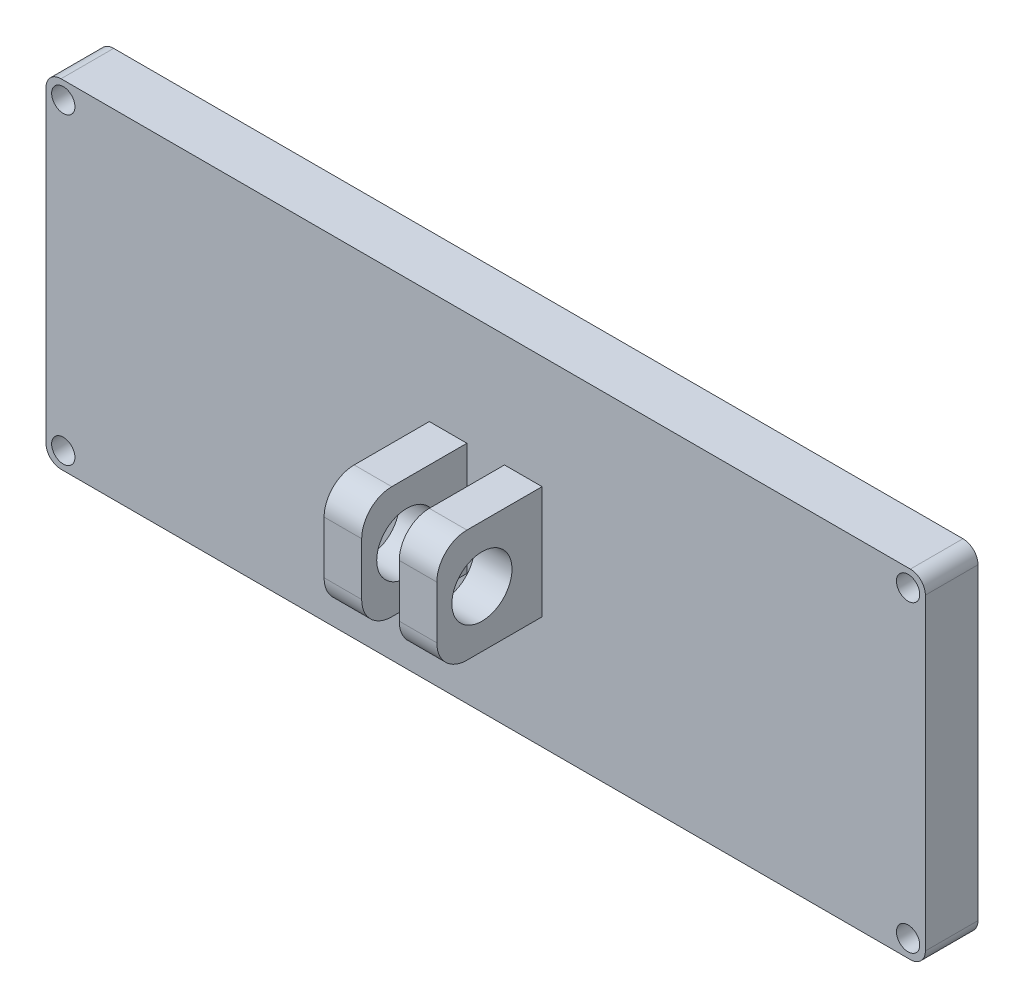
ISO-10303-21;
HEADER;
FILE_DESCRIPTION(('STEP AP214'),'2;1');
FILE_NAME('part.step','',(''),(''),'','','');
FILE_SCHEMA(('AUTOMOTIVE_DESIGN { 1 0 10303 214 1 1 1 1 }'));
ENDSEC;
DATA;
#1=APPLICATION_CONTEXT('core data for automotive mechanical design processes');
#2=APPLICATION_PROTOCOL_DEFINITION('international standard','automotive_design',2000,#1);
#3=PRODUCT_CONTEXT('',#1,'mechanical');
#4=PRODUCT('Part','Part','',(#3));
#5=PRODUCT_RELATED_PRODUCT_CATEGORY('part','',(#4));
#6=PRODUCT_DEFINITION_FORMATION('','',#4);
#7=PRODUCT_DEFINITION_CONTEXT('part definition',#1,'design');
#8=PRODUCT_DEFINITION('design','',#6,#7);
#9=PRODUCT_DEFINITION_SHAPE('','',#8);
#10=(LENGTH_UNIT() NAMED_UNIT(*) SI_UNIT(.MILLI.,.METRE.));
#11=(NAMED_UNIT(*) PLANE_ANGLE_UNIT() SI_UNIT($,.RADIAN.));
#12=(NAMED_UNIT(*) SI_UNIT($,.STERADIAN.) SOLID_ANGLE_UNIT());
#13=UNCERTAINTY_MEASURE_WITH_UNIT(LENGTH_MEASURE(1.E-05),#10,'distance_accuracy_value','');
#14=(GEOMETRIC_REPRESENTATION_CONTEXT(3) GLOBAL_UNCERTAINTY_ASSIGNED_CONTEXT((#13)) GLOBAL_UNIT_ASSIGNED_CONTEXT((#10,
#11,#12)) REPRESENTATION_CONTEXT('',''));
#15=CARTESIAN_POINT('',(0.,0.,0.));
#16=DIRECTION('',(0.,0.,1.));
#17=DIRECTION('',(1.,0.,0.));
#18=AXIS2_PLACEMENT_3D('',#15,#16,#17);
#19=CARTESIAN_POINT('',(54.25,-17.75,5.));
#20=DIRECTION('',(0.,-1.,0.));
#21=DIRECTION('',(0.,0.,-1.));
#22=AXIS2_PLACEMENT_3D('',#19,#20,#21);
#23=PLANE('',#22);
#24=DIRECTION('',(0.,0.,1.));
#25=VECTOR('',#24,1.);
#26=CARTESIAN_POINT('',(-34.25,-17.75,3.5));
#27=LINE('',#26,#25);
#28=CARTESIAN_POINT('',(-34.25,-17.75,3.5));
#29=VERTEX_POINT('',#28);
#30=CARTESIAN_POINT('',(-34.25,-17.75,5.));
#31=VERTEX_POINT('',#30);
#32=EDGE_CURVE('E257',#29,#31,#27,.T.);
#33=ORIENTED_EDGE('',*,*,#32,.T.);
#34=DIRECTION('',(-1.,0.,0.));
#35=VECTOR('',#34,1.);
#36=CARTESIAN_POINT('',(54.25,-17.75,5.));
#37=LINE('',#36,#35);
#38=CARTESIAN_POINT('',(34.25,-17.75,5.));
#39=VERTEX_POINT('',#38);
#40=EDGE_CURVE('E237',#39,#31,#37,.T.);
#41=ORIENTED_EDGE('',*,*,#40,.F.);
#42=DIRECTION('',(0.,0.,1.));
#43=VECTOR('',#42,1.);
#44=CARTESIAN_POINT('',(34.25,-17.75,3.5));
#45=LINE('',#44,#43);
#46=CARTESIAN_POINT('',(34.25,-17.75,3.5));
#47=VERTEX_POINT('',#46);
#48=EDGE_CURVE('E287',#47,#39,#45,.T.);
#49=ORIENTED_EDGE('',*,*,#48,.F.);
#50=DIRECTION('',(-1.,0.,0.));
#51=VECTOR('',#50,1.);
#52=CARTESIAN_POINT('',(54.25,-17.75,3.5));
#53=LINE('',#52,#51);
#54=CARTESIAN_POINT('',(54.25,-17.75,3.5));
#55=VERTEX_POINT('',#54);
#56=EDGE_CURVE('E268',#55,#47,#53,.T.);
#57=ORIENTED_EDGE('',*,*,#56,.F.);
#58=DIRECTION('',(0.,0.,-1.));
#59=VECTOR('',#58,1.);
#60=CARTESIAN_POINT('',(54.25,-17.75,5.));
#61=LINE('',#60,#59);
#62=CARTESIAN_POINT('',(54.25,-17.75,0.));
#63=VERTEX_POINT('',#62);
#64=EDGE_CURVE('E437',#55,#63,#61,.T.);
#65=ORIENTED_EDGE('',*,*,#64,.T.);
#66=DIRECTION('',(-1.,0.,0.));
#67=VECTOR('',#66,1.);
#68=CARTESIAN_POINT('',(54.25,-17.75,0.));
#69=LINE('',#68,#67);
#70=CARTESIAN_POINT('',(-54.25,-17.75,0.));
#71=VERTEX_POINT('',#70);
#72=EDGE_CURVE('E417',#63,#71,#69,.T.);
#73=ORIENTED_EDGE('',*,*,#72,.T.);
#74=DIRECTION('',(0.,0.,-1.));
#75=VECTOR('',#74,1.);
#76=CARTESIAN_POINT('',(-54.25,-17.75,5.));
#77=LINE('',#76,#75);
#78=CARTESIAN_POINT('',(-54.25,-17.75,3.5));
#79=VERTEX_POINT('',#78);
#80=EDGE_CURVE('E433',#79,#71,#77,.T.);
#81=ORIENTED_EDGE('',*,*,#80,.F.);
#82=DIRECTION('',(-1.,0.,0.));
#83=VECTOR('',#82,1.);
#84=CARTESIAN_POINT('',(-54.25,-17.75,3.5));
#85=LINE('',#84,#83);
#86=EDGE_CURVE('E55',#29,#79,#85,.T.);
#87=ORIENTED_EDGE('',*,*,#86,.F.);
#88=EDGE_LOOP('',(#33,#41,#49,#57,#65,#73,#81,#87));
#89=FACE_BOUND('',#88,.T.);
#90=ADVANCED_FACE('F39',(#89),#23,.F.);
#91=CARTESIAN_POINT('',(54.25,17.75,5.));
#92=DIRECTION('',(0.,1.,0.));
#93=DIRECTION('',(0.,0.,1.));
#94=AXIS2_PLACEMENT_3D('',#91,#92,#93);
#95=PLANE('',#94);
#96=DIRECTION('',(0.,0.,1.));
#97=VECTOR('',#96,1.);
#98=CARTESIAN_POINT('',(-34.25,17.75,3.5));
#99=LINE('',#98,#97);
#100=CARTESIAN_POINT('',(-34.25,17.75,3.5));
#101=VERTEX_POINT('',#100);
#102=CARTESIAN_POINT('',(-34.25,17.75,5.));
#103=VERTEX_POINT('',#102);
#104=EDGE_CURVE('E63',#101,#103,#99,.T.);
#105=ORIENTED_EDGE('',*,*,#104,.F.);
#106=DIRECTION('',(1.,0.,0.));
#107=VECTOR('',#106,1.);
#108=CARTESIAN_POINT('',(-54.25,17.75,3.5));
#109=LINE('',#108,#107);
#110=CARTESIAN_POINT('',(-54.25,17.75,3.5));
#111=VERTEX_POINT('',#110);
#112=EDGE_CURVE('E239',#111,#101,#109,.T.);
#113=ORIENTED_EDGE('',*,*,#112,.F.);
#114=DIRECTION('',(0.,0.,-1.));
#115=VECTOR('',#114,1.);
#116=CARTESIAN_POINT('',(-54.25,17.75,5.));
#117=LINE('',#116,#115);
#118=CARTESIAN_POINT('',(-54.25,17.75,0.));
#119=VERTEX_POINT('',#118);
#120=EDGE_CURVE('E227',#111,#119,#117,.T.);
#121=ORIENTED_EDGE('',*,*,#120,.T.);
#122=DIRECTION('',(1.,0.,0.));
#123=VECTOR('',#122,1.);
#124=CARTESIAN_POINT('',(54.25,17.75,0.));
#125=LINE('',#124,#123);
#126=CARTESIAN_POINT('',(54.25,17.75,0.));
#127=VERTEX_POINT('',#126);
#128=EDGE_CURVE('E423',#119,#127,#125,.T.);
#129=ORIENTED_EDGE('',*,*,#128,.T.);
#130=DIRECTION('',(0.,0.,-1.));
#131=VECTOR('',#130,1.);
#132=CARTESIAN_POINT('',(54.25,17.75,5.));
#133=LINE('',#132,#131);
#134=CARTESIAN_POINT('',(54.25,17.75,3.5));
#135=VERTEX_POINT('',#134);
#136=EDGE_CURVE('E236',#135,#127,#133,.T.);
#137=ORIENTED_EDGE('',*,*,#136,.F.);
#138=DIRECTION('',(1.,0.,0.));
#139=VECTOR('',#138,1.);
#140=CARTESIAN_POINT('',(54.25,17.75,3.5));
#141=LINE('',#140,#139);
#142=CARTESIAN_POINT('',(34.25,17.75,3.5));
#143=VERTEX_POINT('',#142);
#144=EDGE_CURVE('E276',#143,#135,#141,.T.);
#145=ORIENTED_EDGE('',*,*,#144,.F.);
#146=DIRECTION('',(0.,0.,1.));
#147=VECTOR('',#146,1.);
#148=CARTESIAN_POINT('',(34.25,17.75,3.5));
#149=LINE('',#148,#147);
#150=CARTESIAN_POINT('',(34.25,17.75,5.));
#151=VERTEX_POINT('',#150);
#152=EDGE_CURVE('E280',#143,#151,#149,.T.);
#153=ORIENTED_EDGE('',*,*,#152,.T.);
#154=DIRECTION('',(1.,0.,0.));
#155=VECTOR('',#154,1.);
#156=CARTESIAN_POINT('',(54.25,17.75,5.));
#157=LINE('',#156,#155);
#158=EDGE_CURVE('E414',#103,#151,#157,.T.);
#159=ORIENTED_EDGE('',*,*,#158,.F.);
#160=EDGE_LOOP('',(#105,#113,#121,#129,#137,#145,#153,#159));
#161=FACE_BOUND('',#160,.T.);
#162=ADVANCED_FACE('F240',(#161),#95,.F.);
#163=CARTESIAN_POINT('',(0.,0.,5.));
#164=DIRECTION('',(0.,0.,1.));
#165=DIRECTION('',(1.,0.,0.));
#166=AXIS2_PLACEMENT_3D('',#163,#164,#165);
#167=PLANE('',#166);
#168=DIRECTION('',(0.,-1.,0.));
#169=VECTOR('',#168,1.);
#170=CARTESIAN_POINT('',(-34.25,17.75,5.));
#171=LINE('',#170,#169);
#172=EDGE_CURVE('E248',#103,#31,#171,.T.);
#173=ORIENTED_EDGE('',*,*,#172,.F.);
#174=ORIENTED_EDGE('',*,*,#158,.T.);
#175=DIRECTION('',(0.,1.,0.));
#176=VECTOR('',#175,1.);
#177=CARTESIAN_POINT('',(34.25,17.75,5.));
#178=LINE('',#177,#176);
#179=EDGE_CURVE('E263',#39,#151,#178,.T.);
#180=ORIENTED_EDGE('',*,*,#179,.F.);
#181=ORIENTED_EDGE('',*,*,#40,.T.);
#182=EDGE_LOOP('',(#173,#174,#180,#181));
#183=FACE_BOUND('',#182,.T.);
#184=ADVANCED_FACE('F644',(#183),#167,.F.);
#185=CARTESIAN_POINT('',(-54.25,-17.75,5.));
#186=DIRECTION('',(-1.,0.,0.));
#187=DIRECTION('',(0.,0.,1.));
#188=AXIS2_PLACEMENT_3D('',#185,#186,#187);
#189=PLANE('',#188);
#190=DIRECTION('',(0.,1.,0.));
#191=VECTOR('',#190,1.);
#192=CARTESIAN_POINT('',(-54.25,17.75,3.5));
#193=LINE('',#192,#191);
#194=EDGE_CURVE('E230',#79,#111,#193,.T.);
#195=ORIENTED_EDGE('',*,*,#194,.F.);
#196=ORIENTED_EDGE('',*,*,#80,.T.);
#197=DIRECTION('',(0.,1.,0.));
#198=VECTOR('',#197,1.);
#199=CARTESIAN_POINT('',(-54.25,-17.75,0.));
#200=LINE('',#199,#198);
#201=EDGE_CURVE('E232',#71,#119,#200,.T.);
#202=ORIENTED_EDGE('',*,*,#201,.T.);
#203=ORIENTED_EDGE('',*,*,#120,.F.);
#204=EDGE_LOOP('',(#195,#196,#202,#203));
#205=FACE_BOUND('',#204,.T.);
#206=ADVANCED_FACE('F228',(#205),#189,.F.);
#207=CARTESIAN_POINT('',(7.5,-7.5,21.));
#208=DIRECTION('',(0.,1.,0.));
#209=DIRECTION('',(-1.,0.,0.));
#210=AXIS2_PLACEMENT_3D('',#207,#208,#209);
#211=PLANE('',#210);
#212=DIRECTION('',(0.,0.,-1.));
#213=VECTOR('',#212,1.);
#214=CARTESIAN_POINT('',(-2.5,-7.5,27.));
#215=LINE('',#214,#213);
#216=CARTESIAN_POINT('',(-2.5,-7.5,17.));
#217=VERTEX_POINT('',#216);
#218=CARTESIAN_POINT('',(-2.5,-7.5,7.));
#219=VERTEX_POINT('',#218);
#220=EDGE_CURVE('E310',#217,#219,#215,.T.);
#221=ORIENTED_EDGE('',*,*,#220,.F.);
#222=DIRECTION('',(1.,0.,0.));
#223=VECTOR('',#222,1.);
#224=CARTESIAN_POINT('',(-7.5,-7.5,17.));
#225=LINE('',#224,#223);
#226=CARTESIAN_POINT('',(-7.5,-7.5,17.));
#227=VERTEX_POINT('',#226);
#228=EDGE_CURVE('E544',#217,#227,#225,.F.);
#229=ORIENTED_EDGE('',*,*,#228,.T.);
#230=DIRECTION('',(0.,0.,-1.));
#231=VECTOR('',#230,1.);
#232=CARTESIAN_POINT('',(-7.5,-7.5,21.));
#233=LINE('',#232,#231);
#234=CARTESIAN_POINT('',(-7.5,-7.5,7.));
#235=VERTEX_POINT('',#234);
#236=EDGE_CURVE('E379',#227,#235,#233,.T.);
#237=ORIENTED_EDGE('',*,*,#236,.T.);
#238=DIRECTION('',(1.,0.,0.));
#239=VECTOR('',#238,1.);
#240=CARTESIAN_POINT('',(7.5,-7.5,7.));
#241=LINE('',#240,#239);
#242=EDGE_CURVE('E357',#235,#219,#241,.T.);
#243=ORIENTED_EDGE('',*,*,#242,.T.);
#244=EDGE_LOOP('',(#221,#229,#237,#243));
#245=FACE_BOUND('',#244,.T.);
#246=ADVANCED_FACE('F611',(#245),#211,.F.);
#247=DIRECTION('',(0.,0.,-1.));
#248=VECTOR('',#247,1.);
#249=CARTESIAN_POINT('',(2.5,-7.5,27.));
#250=LINE('',#249,#248);
#251=CARTESIAN_POINT('',(2.5,-7.5,17.));
#252=VERTEX_POINT('',#251);
#253=CARTESIAN_POINT('',(2.5,-7.5,7.));
#254=VERTEX_POINT('',#253);
#255=EDGE_CURVE('E306',#252,#254,#250,.T.);
#256=ORIENTED_EDGE('',*,*,#255,.T.);
#257=CARTESIAN_POINT('',(7.5,-7.5,7.));
#258=VERTEX_POINT('',#257);
#259=EDGE_CURVE('E356',#254,#258,#241,.T.);
#260=ORIENTED_EDGE('',*,*,#259,.T.);
#261=DIRECTION('',(0.,0.,-1.));
#262=VECTOR('',#261,1.);
#263=CARTESIAN_POINT('',(7.5,-7.5,21.));
#264=LINE('',#263,#262);
#265=CARTESIAN_POINT('',(7.5,-7.5,17.));
#266=VERTEX_POINT('',#265);
#267=EDGE_CURVE('E375',#266,#258,#264,.T.);
#268=ORIENTED_EDGE('',*,*,#267,.F.);
#269=EDGE_CURVE('E545',#266,#252,#225,.F.);
#270=ORIENTED_EDGE('',*,*,#269,.T.);
#271=EDGE_LOOP('',(#256,#260,#268,#270));
#272=FACE_BOUND('',#271,.T.);
#273=ADVANCED_FACE('F588',(#272),#211,.F.);
#274=CARTESIAN_POINT('',(7.5,7.5,21.));
#275=DIRECTION('',(0.,-1.,0.));
#276=DIRECTION('',(1.,0.,0.));
#277=AXIS2_PLACEMENT_3D('',#274,#275,#276);
#278=PLANE('',#277);
#279=DIRECTION('',(0.,0.,-1.));
#280=VECTOR('',#279,1.);
#281=CARTESIAN_POINT('',(-2.5,7.5,27.));
#282=LINE('',#281,#280);
#283=CARTESIAN_POINT('',(-2.5,7.5,17.));
#284=VERTEX_POINT('',#283);
#285=CARTESIAN_POINT('',(-2.5,7.5,7.));
#286=VERTEX_POINT('',#285);
#287=EDGE_CURVE('E299',#284,#286,#282,.T.);
#288=ORIENTED_EDGE('',*,*,#287,.T.);
#289=DIRECTION('',(-1.,0.,0.));
#290=VECTOR('',#289,1.);
#291=CARTESIAN_POINT('',(7.5,7.5,7.));
#292=LINE('',#291,#290);
#293=CARTESIAN_POINT('',(-7.5,7.5,7.));
#294=VERTEX_POINT('',#293);
#295=EDGE_CURVE('E365',#286,#294,#292,.T.);
#296=ORIENTED_EDGE('',*,*,#295,.T.);
#297=DIRECTION('',(0.,0.,-1.));
#298=VECTOR('',#297,1.);
#299=CARTESIAN_POINT('',(-7.5,7.5,21.));
#300=LINE('',#299,#298);
#301=CARTESIAN_POINT('',(-7.5,7.5,17.));
#302=VERTEX_POINT('',#301);
#303=EDGE_CURVE('E351',#302,#294,#300,.T.);
#304=ORIENTED_EDGE('',*,*,#303,.F.);
#305=DIRECTION('',(-1.,0.,0.));
#306=VECTOR('',#305,1.);
#307=CARTESIAN_POINT('',(7.5,7.5,17.));
#308=LINE('',#307,#306);
#309=EDGE_CURVE('E556',#302,#284,#308,.F.);
#310=ORIENTED_EDGE('',*,*,#309,.T.);
#311=EDGE_LOOP('',(#288,#296,#304,#310));
#312=FACE_BOUND('',#311,.T.);
#313=ADVANCED_FACE('F599',(#312),#278,.F.);
#314=DIRECTION('',(0.,0.,-1.));
#315=VECTOR('',#314,1.);
#316=CARTESIAN_POINT('',(2.5,7.5,27.));
#317=LINE('',#316,#315);
#318=CARTESIAN_POINT('',(2.5,7.5,17.));
#319=VERTEX_POINT('',#318);
#320=CARTESIAN_POINT('',(2.5,7.5,7.));
#321=VERTEX_POINT('',#320);
#322=EDGE_CURVE('E303',#319,#321,#317,.T.);
#323=ORIENTED_EDGE('',*,*,#322,.F.);
#324=CARTESIAN_POINT('',(7.5,7.5,17.));
#325=VERTEX_POINT('',#324);
#326=EDGE_CURVE('E555',#319,#325,#308,.F.);
#327=ORIENTED_EDGE('',*,*,#326,.T.);
#328=DIRECTION('',(0.,0.,-1.));
#329=VECTOR('',#328,1.);
#330=CARTESIAN_POINT('',(7.5,7.5,21.));
#331=LINE('',#330,#329);
#332=CARTESIAN_POINT('',(7.5,7.5,7.));
#333=VERTEX_POINT('',#332);
#334=EDGE_CURVE('E372',#325,#333,#331,.T.);
#335=ORIENTED_EDGE('',*,*,#334,.T.);
#336=EDGE_CURVE('E347',#333,#321,#292,.T.);
#337=ORIENTED_EDGE('',*,*,#336,.T.);
#338=EDGE_LOOP('',(#323,#327,#335,#337));
#339=FACE_BOUND('',#338,.T.);
#340=ADVANCED_FACE('F580',(#339),#278,.F.);
#341=CARTESIAN_POINT('',(0.,0.,21.));
#342=DIRECTION('',(0.,0.,1.));
#343=DIRECTION('',(1.,0.,0.));
#344=AXIS2_PLACEMENT_3D('',#341,#342,#343);
#345=PLANE('',#344);
#346=DIRECTION('',(1.,0.,0.));
#347=VECTOR('',#346,1.);
#348=CARTESIAN_POINT('',(7.5,-3.5,21.));
#349=LINE('',#348,#347);
#350=CARTESIAN_POINT('',(-7.5,-3.5,21.));
#351=VERTEX_POINT('',#350);
#352=CARTESIAN_POINT('',(-2.5,-3.5,21.));
#353=VERTEX_POINT('',#352);
#354=EDGE_CURVE('E534',#351,#353,#349,.T.);
#355=ORIENTED_EDGE('',*,*,#354,.T.);
#356=DIRECTION('',(0.,1.,0.));
#357=VECTOR('',#356,1.);
#358=CARTESIAN_POINT('',(-2.5,0.,21.));
#359=LINE('',#358,#357);
#360=CARTESIAN_POINT('',(-2.5,3.5,21.));
#361=VERTEX_POINT('',#360);
#362=EDGE_CURVE('E325',#353,#361,#359,.T.);
#363=ORIENTED_EDGE('',*,*,#362,.T.);
#364=DIRECTION('',(-1.,0.,0.));
#365=VECTOR('',#364,1.);
#366=CARTESIAN_POINT('',(-7.5,3.5,21.));
#367=LINE('',#366,#365);
#368=CARTESIAN_POINT('',(-7.5,3.5,21.));
#369=VERTEX_POINT('',#368);
#370=EDGE_CURVE('E525',#361,#369,#367,.T.);
#371=ORIENTED_EDGE('',*,*,#370,.T.);
#372=DIRECTION('',(0.,-1.,0.));
#373=VECTOR('',#372,1.);
#374=CARTESIAN_POINT('',(-7.5,-7.5,21.));
#375=LINE('',#374,#373);
#376=EDGE_CURVE('E342',#369,#351,#375,.T.);
#377=ORIENTED_EDGE('',*,*,#376,.T.);
#378=EDGE_LOOP('',(#355,#363,#371,#377));
#379=FACE_BOUND('',#378,.T.);
#380=ADVANCED_FACE('F618',(#379),#345,.T.);
#381=CARTESIAN_POINT('',(7.5,3.5,21.));
#382=VERTEX_POINT('',#381);
#383=CARTESIAN_POINT('',(2.5,3.5,21.));
#384=VERTEX_POINT('',#383);
#385=EDGE_CURVE('E529',#382,#384,#367,.T.);
#386=ORIENTED_EDGE('',*,*,#385,.T.);
#387=DIRECTION('',(0.,-1.,0.));
#388=VECTOR('',#387,1.);
#389=CARTESIAN_POINT('',(2.5,0.,21.));
#390=LINE('',#389,#388);
#391=CARTESIAN_POINT('',(2.5,-3.5,21.));
#392=VERTEX_POINT('',#391);
#393=EDGE_CURVE('E313',#384,#392,#390,.T.);
#394=ORIENTED_EDGE('',*,*,#393,.T.);
#395=CARTESIAN_POINT('',(7.5,-3.5,21.));
#396=VERTEX_POINT('',#395);
#397=EDGE_CURVE('E533',#392,#396,#349,.T.);
#398=ORIENTED_EDGE('',*,*,#397,.T.);
#399=DIRECTION('',(0.,1.,0.));
#400=VECTOR('',#399,1.);
#401=CARTESIAN_POINT('',(7.5,-7.5,21.));
#402=LINE('',#401,#400);
#403=EDGE_CURVE('E346',#396,#382,#402,.T.);
#404=ORIENTED_EDGE('',*,*,#403,.T.);
#405=EDGE_LOOP('',(#386,#394,#398,#404));
#406=FACE_BOUND('',#405,.T.);
#407=ADVANCED_FACE('F569',(#406),#345,.T.);
#408=CARTESIAN_POINT('',(58.5,0.,15.));
#409=DIRECTION('',(-1.,0.,0.));
#410=DIRECTION('',(0.,0.,1.));
#411=AXIS2_PLACEMENT_3D('',#408,#409,#410);
#412=CYLINDRICAL_SURFACE('',#411,4.);
#413=CARTESIAN_POINT('',(-7.5,0.,15.));
#414=DIRECTION('',(-1.,0.,0.));
#415=DIRECTION('',(0.,0.,1.));
#416=AXIS2_PLACEMENT_3D('',#413,#414,#415);
#417=CIRCLE('',#416,4.);
#418=CARTESIAN_POINT('',(-7.5,0.,19.));
#419=VERTEX_POINT('',#418);
#420=EDGE_CURVE('E337',#419,#419,#417,.T.);
#421=ORIENTED_EDGE('',*,*,#420,.T.);
#422=EDGE_LOOP('',(#421));
#423=FACE_BOUND('',#422,.T.);
#424=CARTESIAN_POINT('',(-2.5,0.,15.));
#425=DIRECTION('',(1.,0.,0.));
#426=DIRECTION('',(0.,0.,-1.));
#427=AXIS2_PLACEMENT_3D('',#424,#425,#426);
#428=CIRCLE('',#427,4.);
#429=CARTESIAN_POINT('',(-2.5,0.,11.));
#430=VERTEX_POINT('',#429);
#431=EDGE_CURVE('E333',#430,#430,#428,.F.);
#432=ORIENTED_EDGE('',*,*,#431,.F.);
#433=EDGE_LOOP('',(#432));
#434=FACE_BOUND('',#433,.T.);
#435=ADVANCED_FACE('F628',(#423,#434),#412,.F.);
#436=CARTESIAN_POINT('',(7.5,0.,15.));
#437=DIRECTION('',(-1.,0.,0.));
#438=DIRECTION('',(0.,-1.,0.));
#439=AXIS2_PLACEMENT_3D('',#436,#437,#438);
#440=CIRCLE('',#439,4.);
#441=CARTESIAN_POINT('',(7.5,-4.,15.));
#442=VERTEX_POINT('',#441);
#443=EDGE_CURVE('E341',#442,#442,#440,.T.);
#444=ORIENTED_EDGE('',*,*,#443,.F.);
#445=EDGE_LOOP('',(#444));
#446=FACE_BOUND('',#445,.T.);
#447=CARTESIAN_POINT('',(2.5,0.,15.));
#448=DIRECTION('',(-1.,0.,0.));
#449=DIRECTION('',(0.,0.,1.));
#450=AXIS2_PLACEMENT_3D('',#447,#448,#449);
#451=CIRCLE('',#450,4.);
#452=CARTESIAN_POINT('',(2.5,0.,19.));
#453=VERTEX_POINT('',#452);
#454=EDGE_CURVE('E321',#453,#453,#451,.F.);
#455=ORIENTED_EDGE('',*,*,#454,.F.);
#456=EDGE_LOOP('',(#455));
#457=FACE_BOUND('',#456,.T.);
#458=ADVANCED_FACE('F630',(#446,#457),#412,.F.);
#459=CARTESIAN_POINT('',(0.,-3.5,17.));
#460=DIRECTION('',(-1.,0.,0.));
#461=DIRECTION('',(0.,-1.,0.));
#462=AXIS2_PLACEMENT_3D('',#459,#460,#461);
#463=CYLINDRICAL_SURFACE('',#462,4.);
#464=ORIENTED_EDGE('',*,*,#228,.F.);
#465=CARTESIAN_POINT('',(-2.5,-3.5,17.));
#466=DIRECTION('',(1.,0.,0.));
#467=DIRECTION('',(0.,0.,-1.));
#468=AXIS2_PLACEMENT_3D('',#465,#466,#467);
#469=CIRCLE('',#468,4.);
#470=EDGE_CURVE('E329',#217,#353,#469,.F.);
#471=ORIENTED_EDGE('',*,*,#470,.T.);
#472=ORIENTED_EDGE('',*,*,#354,.F.);
#473=CARTESIAN_POINT('',(-7.5,-3.5,17.));
#474=DIRECTION('',(1.,0.,0.));
#475=DIRECTION('',(0.,0.,-1.));
#476=AXIS2_PLACEMENT_3D('',#473,#474,#475);
#477=CIRCLE('',#476,4.);
#478=EDGE_CURVE('E552',#227,#351,#477,.F.);
#479=ORIENTED_EDGE('',*,*,#478,.F.);
#480=EDGE_LOOP('',(#464,#471,#472,#479));
#481=FACE_BOUND('',#480,.T.);
#482=ADVANCED_FACE('F616',(#481),#463,.T.);
#483=ORIENTED_EDGE('',*,*,#397,.F.);
#484=CARTESIAN_POINT('',(2.5,-3.5,17.));
#485=DIRECTION('',(-1.,0.,0.));
#486=DIRECTION('',(0.,0.,1.));
#487=AXIS2_PLACEMENT_3D('',#484,#485,#486);
#488=CIRCLE('',#487,4.);
#489=EDGE_CURVE('E317',#392,#252,#488,.F.);
#490=ORIENTED_EDGE('',*,*,#489,.T.);
#491=ORIENTED_EDGE('',*,*,#269,.F.);
#492=CARTESIAN_POINT('',(7.5,-3.5,17.));
#493=DIRECTION('',(-1.,0.,0.));
#494=DIRECTION('',(0.,-1.,0.));
#495=AXIS2_PLACEMENT_3D('',#492,#493,#494);
#496=CIRCLE('',#495,4.);
#497=EDGE_CURVE('E541',#396,#266,#496,.F.);
#498=ORIENTED_EDGE('',*,*,#497,.F.);
#499=EDGE_LOOP('',(#483,#490,#491,#498));
#500=FACE_BOUND('',#499,.T.);
#501=ADVANCED_FACE('F591',(#500),#463,.T.);
#502=CARTESIAN_POINT('',(0.,3.5,17.));
#503=DIRECTION('',(1.,0.,0.));
#504=DIRECTION('',(0.,1.,0.));
#505=AXIS2_PLACEMENT_3D('',#502,#503,#504);
#506=CYLINDRICAL_SURFACE('',#505,4.);
#507=ORIENTED_EDGE('',*,*,#370,.F.);
#508=CARTESIAN_POINT('',(-2.5,3.5,17.));
#509=DIRECTION('',(1.,0.,0.));
#510=DIRECTION('',(0.,0.,-1.));
#511=AXIS2_PLACEMENT_3D('',#508,#509,#510);
#512=CIRCLE('',#511,4.);
#513=EDGE_CURVE('E11',#361,#284,#512,.F.);
#514=ORIENTED_EDGE('',*,*,#513,.T.);
#515=ORIENTED_EDGE('',*,*,#309,.F.);
#516=CARTESIAN_POINT('',(-7.5,3.5,17.));
#517=DIRECTION('',(1.,0.,0.));
#518=DIRECTION('',(0.,0.,-1.));
#519=AXIS2_PLACEMENT_3D('',#516,#517,#518);
#520=CIRCLE('',#519,4.);
#521=EDGE_CURVE('E549',#369,#302,#520,.F.);
#522=ORIENTED_EDGE('',*,*,#521,.F.);
#523=EDGE_LOOP('',(#507,#514,#515,#522));
#524=FACE_BOUND('',#523,.T.);
#525=ADVANCED_FACE('F41',(#524),#506,.T.);
#526=ORIENTED_EDGE('',*,*,#326,.F.);
#527=CARTESIAN_POINT('',(2.5,3.5,17.));
#528=DIRECTION('',(-1.,0.,0.));
#529=DIRECTION('',(0.,0.,1.));
#530=AXIS2_PLACEMENT_3D('',#527,#528,#529);
#531=CIRCLE('',#530,4.);
#532=EDGE_CURVE('E48',#319,#384,#531,.F.);
#533=ORIENTED_EDGE('',*,*,#532,.T.);
#534=ORIENTED_EDGE('',*,*,#385,.F.);
#535=CARTESIAN_POINT('',(7.5,3.5,17.));
#536=DIRECTION('',(-1.,0.,0.));
#537=DIRECTION('',(0.,-1.,0.));
#538=AXIS2_PLACEMENT_3D('',#535,#536,#537);
#539=CIRCLE('',#538,4.);
#540=EDGE_CURVE('E538',#325,#382,#539,.F.);
#541=ORIENTED_EDGE('',*,*,#540,.F.);
#542=EDGE_LOOP('',(#526,#533,#534,#541));
#543=FACE_BOUND('',#542,.T.);
#544=ADVANCED_FACE('F564',(#543),#506,.T.);
#545=CARTESIAN_POINT('',(0.,0.,7.));
#546=DIRECTION('',(0.,0.,-1.));
#547=DIRECTION('',(-1.,0.,0.));
#548=AXIS2_PLACEMENT_3D('',#545,#546,#547);
#549=PLANE('',#548);
#550=ORIENTED_EDGE('',*,*,#259,.F.);
#551=DIRECTION('',(0.,1.,0.));
#552=VECTOR('',#551,1.);
#553=CARTESIAN_POINT('',(2.5,-7.5,7.));
#554=LINE('',#553,#552);
#555=EDGE_CURVE('E295',#254,#321,#554,.T.);
#556=ORIENTED_EDGE('',*,*,#555,.T.);
#557=ORIENTED_EDGE('',*,*,#336,.F.);
#558=DIRECTION('',(0.,1.,0.));
#559=VECTOR('',#558,1.);
#560=CARTESIAN_POINT('',(7.5,-7.5,7.));
#561=LINE('',#560,#559);
#562=EDGE_CURVE('E361',#258,#333,#561,.T.);
#563=ORIENTED_EDGE('',*,*,#562,.F.);
#564=EDGE_LOOP('',(#550,#556,#557,#563));
#565=FACE_BOUND('',#564,.T.);
#566=DIRECTION('',(0.,-1.,0.));
#567=VECTOR('',#566,1.);
#568=CARTESIAN_POINT('',(-58.5,-22.5,7.));
#569=LINE('',#568,#567);
#570=CARTESIAN_POINT('',(-58.5,20.5,7.));
#571=VERTEX_POINT('',#570);
#572=CARTESIAN_POINT('',(-58.5,-20.5,7.));
#573=VERTEX_POINT('',#572);
#574=EDGE_CURVE('E451',#571,#573,#569,.T.);
#575=ORIENTED_EDGE('',*,*,#574,.T.);
#576=CARTESIAN_POINT('',(-56.5,-20.5,7.));
#577=DIRECTION('',(0.,0.,-1.));
#578=DIRECTION('',(-1.,0.,0.));
#579=AXIS2_PLACEMENT_3D('',#576,#577,#578);
#580=CIRCLE('',#579,2.);
#581=CARTESIAN_POINT('',(-56.5,-22.5,7.));
#582=VERTEX_POINT('',#581);
#583=EDGE_CURVE('E508',#573,#582,#580,.F.);
#584=ORIENTED_EDGE('',*,*,#583,.T.);
#585=DIRECTION('',(1.,0.,0.));
#586=VECTOR('',#585,1.);
#587=CARTESIAN_POINT('',(-58.5,-22.5,7.));
#588=LINE('',#587,#586);
#589=CARTESIAN_POINT('',(56.5,-22.5,7.));
#590=VERTEX_POINT('',#589);
#591=EDGE_CURVE('E455',#582,#590,#588,.T.);
#592=ORIENTED_EDGE('',*,*,#591,.T.);
#593=CARTESIAN_POINT('',(56.5,-20.5,7.));
#594=DIRECTION('',(0.,0.,-1.));
#595=DIRECTION('',(-1.,0.,0.));
#596=AXIS2_PLACEMENT_3D('',#593,#594,#595);
#597=CIRCLE('',#596,2.);
#598=CARTESIAN_POINT('',(58.5,-20.5,7.));
#599=VERTEX_POINT('',#598);
#600=EDGE_CURVE('E505',#590,#599,#597,.F.);
#601=ORIENTED_EDGE('',*,*,#600,.T.);
#602=DIRECTION('',(0.,1.,0.));
#603=VECTOR('',#602,1.);
#604=CARTESIAN_POINT('',(58.5,-22.5,7.));
#605=LINE('',#604,#603);
#606=CARTESIAN_POINT('',(58.5,20.5,7.));
#607=VERTEX_POINT('',#606);
#608=EDGE_CURVE('E442',#599,#607,#605,.T.);
#609=ORIENTED_EDGE('',*,*,#608,.T.);
#610=CARTESIAN_POINT('',(56.5,20.5,7.));
#611=DIRECTION('',(0.,0.,-1.));
#612=DIRECTION('',(-1.,0.,0.));
#613=AXIS2_PLACEMENT_3D('',#610,#611,#612);
#614=CIRCLE('',#613,2.);
#615=CARTESIAN_POINT('',(56.5,22.5,7.));
#616=VERTEX_POINT('',#615);
#617=EDGE_CURVE('E502',#607,#616,#614,.F.);
#618=ORIENTED_EDGE('',*,*,#617,.T.);
#619=DIRECTION('',(-1.,0.,0.));
#620=VECTOR('',#619,1.);
#621=CARTESIAN_POINT('',(-58.5,22.5,7.));
#622=LINE('',#621,#620);
#623=CARTESIAN_POINT('',(-56.5,22.5,7.));
#624=VERTEX_POINT('',#623);
#625=EDGE_CURVE('E446',#616,#624,#622,.T.);
#626=ORIENTED_EDGE('',*,*,#625,.T.);
#627=CARTESIAN_POINT('',(-56.5,20.5,7.));
#628=DIRECTION('',(0.,0.,-1.));
#629=DIRECTION('',(-1.,0.,0.));
#630=AXIS2_PLACEMENT_3D('',#627,#628,#629);
#631=CIRCLE('',#630,2.);
#632=EDGE_CURVE('E499',#624,#571,#631,.F.);
#633=ORIENTED_EDGE('',*,*,#632,.T.);
#634=EDGE_LOOP('',(#575,#584,#592,#601,#609,#618,#626,#633));
#635=FACE_BOUND('',#634,.T.);
#636=CARTESIAN_POINT('',(56.2,20.2,7.));
#637=DIRECTION('',(0.,0.,-1.));
#638=DIRECTION('',(-1.,0.,0.));
#639=AXIS2_PLACEMENT_3D('',#636,#637,#638);
#640=CIRCLE('',#639,1.55);
#641=CARTESIAN_POINT('',(54.65,20.2,7.));
#642=VERTEX_POINT('',#641);
#643=EDGE_CURVE('E407',#642,#642,#640,.T.);
#644=ORIENTED_EDGE('',*,*,#643,.T.);
#645=EDGE_LOOP('',(#644));
#646=FACE_BOUND('',#645,.T.);
#647=CARTESIAN_POINT('',(56.2,-20.2,7.));
#648=DIRECTION('',(0.,0.,-1.));
#649=DIRECTION('',(1.,0.,0.));
#650=AXIS2_PLACEMENT_3D('',#647,#648,#649);
#651=CIRCLE('',#650,1.55);
#652=CARTESIAN_POINT('',(57.75,-20.2,7.));
#653=VERTEX_POINT('',#652);
#654=EDGE_CURVE('E383',#653,#653,#651,.T.);
#655=ORIENTED_EDGE('',*,*,#654,.T.);
#656=EDGE_LOOP('',(#655));
#657=FACE_BOUND('',#656,.T.);
#658=CARTESIAN_POINT('',(-56.2,-20.2,7.));
#659=DIRECTION('',(0.,0.,-1.));
#660=DIRECTION('',(-1.,0.,0.));
#661=AXIS2_PLACEMENT_3D('',#658,#659,#660);
#662=CIRCLE('',#661,1.55);
#663=CARTESIAN_POINT('',(-57.75,-20.2,7.));
#664=VERTEX_POINT('',#663);
#665=EDGE_CURVE('E392',#664,#664,#662,.T.);
#666=ORIENTED_EDGE('',*,*,#665,.T.);
#667=EDGE_LOOP('',(#666));
#668=FACE_BOUND('',#667,.T.);
#669=CARTESIAN_POINT('',(-56.2,20.2,7.));
#670=DIRECTION('',(0.,0.,-1.));
#671=DIRECTION('',(1.,0.,0.));
#672=AXIS2_PLACEMENT_3D('',#669,#670,#671);
#673=CIRCLE('',#672,1.55);
#674=CARTESIAN_POINT('',(-54.65,20.2,7.));
#675=VERTEX_POINT('',#674);
#676=EDGE_CURVE('E400',#675,#675,#673,.T.);
#677=ORIENTED_EDGE('',*,*,#676,.T.);
#678=EDGE_LOOP('',(#677));
#679=FACE_BOUND('',#678,.T.);
#680=DIRECTION('',(0.,-1.,0.));
#681=VECTOR('',#680,1.);
#682=CARTESIAN_POINT('',(-7.5,-7.5,7.));
#683=LINE('',#682,#681);
#684=EDGE_CURVE('E352',#294,#235,#683,.T.);
#685=ORIENTED_EDGE('',*,*,#684,.F.);
#686=ORIENTED_EDGE('',*,*,#295,.F.);
#687=DIRECTION('',(0.,-1.,0.));
#688=VECTOR('',#687,1.);
#689=CARTESIAN_POINT('',(-2.5,-7.5,7.));
#690=LINE('',#689,#688);
#691=EDGE_CURVE('E291',#286,#219,#690,.T.);
#692=ORIENTED_EDGE('',*,*,#691,.T.);
#693=ORIENTED_EDGE('',*,*,#242,.F.);
#694=EDGE_LOOP('',(#685,#686,#692,#693));
#695=FACE_BOUND('',#694,.T.);
#696=ADVANCED_FACE('F583',(#565,#635,#646,#657,#668,#679,#695),#549,.F.);
#697=CARTESIAN_POINT('',(58.5,-22.5,7.));
#698=DIRECTION('',(-1.,0.,0.));
#699=DIRECTION('',(0.,0.,1.));
#700=AXIS2_PLACEMENT_3D('',#697,#698,#699);
#701=PLANE('',#700);
#702=ORIENTED_EDGE('',*,*,#608,.F.);
#703=DIRECTION('',(0.,0.,-1.));
#704=VECTOR('',#703,1.);
#705=CARTESIAN_POINT('',(58.5,-20.5,7.));
#706=LINE('',#705,#704);
#707=CARTESIAN_POINT('',(58.5,-20.5,0.));
#708=VERTEX_POINT('',#707);
#709=EDGE_CURVE('E514',#599,#708,#706,.T.);
#710=ORIENTED_EDGE('',*,*,#709,.T.);
#711=DIRECTION('',(0.,1.,0.));
#712=VECTOR('',#711,1.);
#713=CARTESIAN_POINT('',(58.5,-22.5,0.));
#714=LINE('',#713,#712);
#715=CARTESIAN_POINT('',(58.5,20.5,0.));
#716=VERTEX_POINT('',#715);
#717=EDGE_CURVE('E436',#708,#716,#714,.T.);
#718=ORIENTED_EDGE('',*,*,#717,.T.);
#719=DIRECTION('',(0.,0.,-1.));
#720=VECTOR('',#719,1.);
#721=CARTESIAN_POINT('',(58.5,20.5,7.));
#722=LINE('',#721,#720);
#723=EDGE_CURVE('E511',#716,#607,#722,.F.);
#724=ORIENTED_EDGE('',*,*,#723,.T.);
#725=EDGE_LOOP('',(#702,#710,#718,#724));
#726=FACE_BOUND('',#725,.T.);
#727=ADVANCED_FACE('F659',(#726),#701,.F.);
#728=CARTESIAN_POINT('',(-58.5,22.5,7.));
#729=DIRECTION('',(0.,-1.,0.));
#730=DIRECTION('',(0.,0.,-1.));
#731=AXIS2_PLACEMENT_3D('',#728,#729,#730);
#732=PLANE('',#731);
#733=ORIENTED_EDGE('',*,*,#625,.F.);
#734=DIRECTION('',(0.,0.,-1.));
#735=VECTOR('',#734,1.);
#736=CARTESIAN_POINT('',(56.5,22.5,7.));
#737=LINE('',#736,#735);
#738=CARTESIAN_POINT('',(56.5,22.5,0.));
#739=VERTEX_POINT('',#738);
#740=EDGE_CURVE('E521',#616,#739,#737,.T.);
#741=ORIENTED_EDGE('',*,*,#740,.T.);
#742=DIRECTION('',(-1.,0.,0.));
#743=VECTOR('',#742,1.);
#744=CARTESIAN_POINT('',(-58.5,22.5,0.));
#745=LINE('',#744,#743);
#746=CARTESIAN_POINT('',(-56.5,22.5,0.));
#747=VERTEX_POINT('',#746);
#748=EDGE_CURVE('E463',#739,#747,#745,.T.);
#749=ORIENTED_EDGE('',*,*,#748,.T.);
#750=DIRECTION('',(0.,0.,-1.));
#751=VECTOR('',#750,1.);
#752=CARTESIAN_POINT('',(-56.5,22.5,7.));
#753=LINE('',#752,#751);
#754=EDGE_CURVE('E518',#747,#624,#753,.F.);
#755=ORIENTED_EDGE('',*,*,#754,.T.);
#756=EDGE_LOOP('',(#733,#741,#749,#755));
#757=FACE_BOUND('',#756,.T.);
#758=ADVANCED_FACE('F672',(#757),#732,.F.);
#759=CARTESIAN_POINT('',(-58.5,-22.5,7.));
#760=DIRECTION('',(1.,0.,0.));
#761=DIRECTION('',(0.,0.,-1.));
#762=AXIS2_PLACEMENT_3D('',#759,#760,#761);
#763=PLANE('',#762);
#764=DIRECTION('',(0.,-1.,0.));
#765=VECTOR('',#764,1.);
#766=CARTESIAN_POINT('',(-58.5,-22.5,0.));
#767=LINE('',#766,#765);
#768=CARTESIAN_POINT('',(-58.5,20.5,0.));
#769=VERTEX_POINT('',#768);
#770=CARTESIAN_POINT('',(-58.5,-20.5,0.));
#771=VERTEX_POINT('',#770);
#772=EDGE_CURVE('E467',#769,#771,#767,.T.);
#773=ORIENTED_EDGE('',*,*,#772,.T.);
#774=DIRECTION('',(0.,0.,-1.));
#775=VECTOR('',#774,1.);
#776=CARTESIAN_POINT('',(-58.5,-20.5,7.));
#777=LINE('',#776,#775);
#778=EDGE_CURVE('E496',#771,#573,#777,.F.);
#779=ORIENTED_EDGE('',*,*,#778,.T.);
#780=ORIENTED_EDGE('',*,*,#574,.F.);
#781=DIRECTION('',(0.,0.,-1.));
#782=VECTOR('',#781,1.);
#783=CARTESIAN_POINT('',(-58.5,20.5,7.));
#784=LINE('',#783,#782);
#785=EDGE_CURVE('E492',#571,#769,#784,.T.);
#786=ORIENTED_EDGE('',*,*,#785,.T.);
#787=EDGE_LOOP('',(#773,#779,#780,#786));
#788=FACE_BOUND('',#787,.T.);
#789=ADVANCED_FACE('F668',(#788),#763,.F.);
#790=CARTESIAN_POINT('',(-58.5,-22.5,7.));
#791=DIRECTION('',(0.,1.,0.));
#792=DIRECTION('',(0.,0.,1.));
#793=AXIS2_PLACEMENT_3D('',#790,#791,#792);
#794=PLANE('',#793);
#795=ORIENTED_EDGE('',*,*,#591,.F.);
#796=DIRECTION('',(0.,0.,-1.));
#797=VECTOR('',#796,1.);
#798=CARTESIAN_POINT('',(-56.5,-22.5,7.));
#799=LINE('',#798,#797);
#800=CARTESIAN_POINT('',(-56.5,-22.5,0.));
#801=VERTEX_POINT('',#800);
#802=EDGE_CURVE('E476',#582,#801,#799,.T.);
#803=ORIENTED_EDGE('',*,*,#802,.T.);
#804=DIRECTION('',(1.,0.,0.));
#805=VECTOR('',#804,1.);
#806=CARTESIAN_POINT('',(-58.5,-22.5,0.));
#807=LINE('',#806,#805);
#808=CARTESIAN_POINT('',(56.5,-22.5,0.));
#809=VERTEX_POINT('',#808);
#810=EDGE_CURVE('E447',#801,#809,#807,.T.);
#811=ORIENTED_EDGE('',*,*,#810,.T.);
#812=DIRECTION('',(0.,0.,-1.));
#813=VECTOR('',#812,1.);
#814=CARTESIAN_POINT('',(56.5,-22.5,7.));
#815=LINE('',#814,#813);
#816=EDGE_CURVE('E459',#809,#590,#815,.F.);
#817=ORIENTED_EDGE('',*,*,#816,.T.);
#818=EDGE_LOOP('',(#795,#803,#811,#817));
#819=FACE_BOUND('',#818,.T.);
#820=ADVANCED_FACE('F664',(#819),#794,.F.);
#821=CARTESIAN_POINT('',(0.,0.,0.));
#822=DIRECTION('',(0.,0.,-1.));
#823=DIRECTION('',(-1.,0.,0.));
#824=AXIS2_PLACEMENT_3D('',#821,#822,#823);
#825=PLANE('',#824);
#826=CARTESIAN_POINT('',(-56.2,20.2,0.));
#827=DIRECTION('',(0.,0.,-1.));
#828=DIRECTION('',(1.,0.,0.));
#829=AXIS2_PLACEMENT_3D('',#826,#827,#828);
#830=CIRCLE('',#829,1.55);
#831=CARTESIAN_POINT('',(-54.65,20.2,0.));
#832=VERTEX_POINT('',#831);
#833=EDGE_CURVE('E382',#832,#832,#830,.T.);
#834=ORIENTED_EDGE('',*,*,#833,.F.);
#835=EDGE_LOOP('',(#834));
#836=FACE_BOUND('',#835,.T.);
#837=CARTESIAN_POINT('',(-56.2,-20.2,0.));
#838=DIRECTION('',(0.,0.,-1.));
#839=DIRECTION('',(-1.,0.,0.));
#840=AXIS2_PLACEMENT_3D('',#837,#838,#839);
#841=CIRCLE('',#840,1.55);
#842=CARTESIAN_POINT('',(-57.75,-20.2,0.));
#843=VERTEX_POINT('',#842);
#844=EDGE_CURVE('E396',#843,#843,#841,.T.);
#845=ORIENTED_EDGE('',*,*,#844,.F.);
#846=EDGE_LOOP('',(#845));
#847=FACE_BOUND('',#846,.T.);
#848=CARTESIAN_POINT('',(56.2,-20.2,0.));
#849=DIRECTION('',(0.,0.,-1.));
#850=DIRECTION('',(1.,0.,0.));
#851=AXIS2_PLACEMENT_3D('',#848,#849,#850);
#852=CIRCLE('',#851,1.55);
#853=CARTESIAN_POINT('',(57.75,-20.2,0.));
#854=VERTEX_POINT('',#853);
#855=EDGE_CURVE('E388',#854,#854,#852,.T.);
#856=ORIENTED_EDGE('',*,*,#855,.F.);
#857=EDGE_LOOP('',(#856));
#858=FACE_BOUND('',#857,.T.);
#859=CARTESIAN_POINT('',(56.2,20.2,0.));
#860=DIRECTION('',(0.,0.,-1.));
#861=DIRECTION('',(-1.,0.,0.));
#862=AXIS2_PLACEMENT_3D('',#859,#860,#861);
#863=CIRCLE('',#862,1.55);
#864=CARTESIAN_POINT('',(54.65,20.2,0.));
#865=VERTEX_POINT('',#864);
#866=EDGE_CURVE('E387',#865,#865,#863,.T.);
#867=ORIENTED_EDGE('',*,*,#866,.F.);
#868=EDGE_LOOP('',(#867));
#869=FACE_BOUND('',#868,.T.);
#870=ORIENTED_EDGE('',*,*,#201,.F.);
#871=ORIENTED_EDGE('',*,*,#72,.F.);
#872=DIRECTION('',(0.,-1.,0.));
#873=VECTOR('',#872,1.);
#874=CARTESIAN_POINT('',(54.25,-17.75,0.));
#875=LINE('',#874,#873);
#876=EDGE_CURVE('E426',#127,#63,#875,.T.);
#877=ORIENTED_EDGE('',*,*,#876,.F.);
#878=ORIENTED_EDGE('',*,*,#128,.F.);
#879=EDGE_LOOP('',(#870,#871,#877,#878));
#880=FACE_BOUND('',#879,.T.);
#881=ORIENTED_EDGE('',*,*,#810,.F.);
#882=CARTESIAN_POINT('',(-56.5,-20.5,0.));
#883=DIRECTION('',(0.,0.,-1.));
#884=DIRECTION('',(-1.,0.,0.));
#885=AXIS2_PLACEMENT_3D('',#882,#883,#884);
#886=CIRCLE('',#885,2.);
#887=EDGE_CURVE('E489',#801,#771,#886,.T.);
#888=ORIENTED_EDGE('',*,*,#887,.T.);
#889=ORIENTED_EDGE('',*,*,#772,.F.);
#890=CARTESIAN_POINT('',(-56.5,20.5,0.));
#891=DIRECTION('',(0.,0.,-1.));
#892=DIRECTION('',(-1.,0.,0.));
#893=AXIS2_PLACEMENT_3D('',#890,#891,#892);
#894=CIRCLE('',#893,2.);
#895=EDGE_CURVE('E480',#769,#747,#894,.T.);
#896=ORIENTED_EDGE('',*,*,#895,.T.);
#897=ORIENTED_EDGE('',*,*,#748,.F.);
#898=CARTESIAN_POINT('',(56.5,20.5,0.));
#899=DIRECTION('',(0.,0.,-1.));
#900=DIRECTION('',(-1.,0.,0.));
#901=AXIS2_PLACEMENT_3D('',#898,#899,#900);
#902=CIRCLE('',#901,2.);
#903=EDGE_CURVE('E483',#739,#716,#902,.T.);
#904=ORIENTED_EDGE('',*,*,#903,.T.);
#905=ORIENTED_EDGE('',*,*,#717,.F.);
#906=CARTESIAN_POINT('',(56.5,-20.5,0.));
#907=DIRECTION('',(0.,0.,-1.));
#908=DIRECTION('',(-1.,0.,0.));
#909=AXIS2_PLACEMENT_3D('',#906,#907,#908);
#910=CIRCLE('',#909,2.);
#911=EDGE_CURVE('E486',#708,#809,#910,.T.);
#912=ORIENTED_EDGE('',*,*,#911,.T.);
#913=EDGE_LOOP('',(#881,#888,#889,#896,#897,#904,#905,#912));
#914=FACE_BOUND('',#913,.T.);
#915=ADVANCED_FACE('F660',(#836,#847,#858,#869,#880,#914),#825,.T.);
#916=CARTESIAN_POINT('',(-56.5,-20.5,7.));
#917=DIRECTION('',(0.,0.,-1.));
#918=DIRECTION('',(-1.,0.,0.));
#919=AXIS2_PLACEMENT_3D('',#916,#917,#918);
#920=CYLINDRICAL_SURFACE('',#919,2.);
#921=ORIENTED_EDGE('',*,*,#583,.F.);
#922=ORIENTED_EDGE('',*,*,#778,.F.);
#923=ORIENTED_EDGE('',*,*,#887,.F.);
#924=ORIENTED_EDGE('',*,*,#802,.F.);
#925=EDGE_LOOP('',(#921,#922,#923,#924));
#926=FACE_BOUND('',#925,.T.);
#927=ADVANCED_FACE('F663',(#926),#920,.T.);
#928=CARTESIAN_POINT('',(56.5,-20.5,7.));
#929=DIRECTION('',(0.,0.,-1.));
#930=DIRECTION('',(-1.,0.,0.));
#931=AXIS2_PLACEMENT_3D('',#928,#929,#930);
#932=CYLINDRICAL_SURFACE('',#931,2.);
#933=ORIENTED_EDGE('',*,*,#600,.F.);
#934=ORIENTED_EDGE('',*,*,#816,.F.);
#935=ORIENTED_EDGE('',*,*,#911,.F.);
#936=ORIENTED_EDGE('',*,*,#709,.F.);
#937=EDGE_LOOP('',(#933,#934,#935,#936));
#938=FACE_BOUND('',#937,.T.);
#939=ADVANCED_FACE('F682',(#938),#932,.T.);
#940=CARTESIAN_POINT('',(56.5,20.5,7.));
#941=DIRECTION('',(0.,0.,-1.));
#942=DIRECTION('',(-1.,0.,0.));
#943=AXIS2_PLACEMENT_3D('',#940,#941,#942);
#944=CYLINDRICAL_SURFACE('',#943,2.);
#945=ORIENTED_EDGE('',*,*,#617,.F.);
#946=ORIENTED_EDGE('',*,*,#723,.F.);
#947=ORIENTED_EDGE('',*,*,#903,.F.);
#948=ORIENTED_EDGE('',*,*,#740,.F.);
#949=EDGE_LOOP('',(#945,#946,#947,#948));
#950=FACE_BOUND('',#949,.T.);
#951=ADVANCED_FACE('F686',(#950),#944,.T.);
#952=CARTESIAN_POINT('',(-56.5,20.5,7.));
#953=DIRECTION('',(0.,0.,-1.));
#954=DIRECTION('',(-1.,0.,0.));
#955=AXIS2_PLACEMENT_3D('',#952,#953,#954);
#956=CYLINDRICAL_SURFACE('',#955,2.);
#957=ORIENTED_EDGE('',*,*,#632,.F.);
#958=ORIENTED_EDGE('',*,*,#754,.F.);
#959=ORIENTED_EDGE('',*,*,#895,.F.);
#960=ORIENTED_EDGE('',*,*,#785,.F.);
#961=EDGE_LOOP('',(#957,#958,#959,#960));
#962=FACE_BOUND('',#961,.T.);
#963=ADVANCED_FACE('F652',(#962),#956,.T.);
#964=CARTESIAN_POINT('',(54.25,-17.75,5.));
#965=DIRECTION('',(1.,0.,0.));
#966=DIRECTION('',(0.,0.,-1.));
#967=AXIS2_PLACEMENT_3D('',#964,#965,#966);
#968=PLANE('',#967);
#969=ORIENTED_EDGE('',*,*,#64,.F.);
#970=DIRECTION('',(0.,-1.,0.));
#971=VECTOR('',#970,1.);
#972=CARTESIAN_POINT('',(54.25,17.75,3.5));
#973=LINE('',#972,#971);
#974=EDGE_CURVE('E264',#135,#55,#973,.T.);
#975=ORIENTED_EDGE('',*,*,#974,.F.);
#976=ORIENTED_EDGE('',*,*,#136,.T.);
#977=ORIENTED_EDGE('',*,*,#876,.T.);
#978=EDGE_LOOP('',(#969,#975,#976,#977));
#979=FACE_BOUND('',#978,.T.);
#980=ADVANCED_FACE('F649',(#979),#968,.F.);
#981=CARTESIAN_POINT('',(56.2,20.2,7.));
#982=DIRECTION('',(0.,0.,-1.));
#983=DIRECTION('',(-1.,0.,0.));
#984=AXIS2_PLACEMENT_3D('',#981,#982,#983);
#985=CYLINDRICAL_SURFACE('',#984,1.55);
#986=ORIENTED_EDGE('',*,*,#643,.F.);
#987=EDGE_LOOP('',(#986));
#988=FACE_BOUND('',#987,.T.);
#989=ORIENTED_EDGE('',*,*,#866,.T.);
#990=EDGE_LOOP('',(#989));
#991=FACE_BOUND('',#990,.T.);
#992=ADVANCED_FACE('F651',(#988,#991),#985,.F.);
#993=CARTESIAN_POINT('',(56.2,-20.2,7.));
#994=DIRECTION('',(0.,0.,-1.));
#995=DIRECTION('',(-1.,0.,0.));
#996=AXIS2_PLACEMENT_3D('',#993,#994,#995);
#997=CYLINDRICAL_SURFACE('',#996,1.55);
#998=ORIENTED_EDGE('',*,*,#654,.F.);
#999=EDGE_LOOP('',(#998));
#1000=FACE_BOUND('',#999,.T.);
#1001=ORIENTED_EDGE('',*,*,#855,.T.);
#1002=EDGE_LOOP('',(#1001));
#1003=FACE_BOUND('',#1002,.T.);
#1004=ADVANCED_FACE('F758',(#1000,#1003),#997,.F.);
#1005=CARTESIAN_POINT('',(-56.2,-20.2,7.));
#1006=DIRECTION('',(0.,0.,-1.));
#1007=DIRECTION('',(-1.,0.,0.));
#1008=AXIS2_PLACEMENT_3D('',#1005,#1006,#1007);
#1009=CYLINDRICAL_SURFACE('',#1008,1.55);
#1010=ORIENTED_EDGE('',*,*,#665,.F.);
#1011=EDGE_LOOP('',(#1010));
#1012=FACE_BOUND('',#1011,.T.);
#1013=ORIENTED_EDGE('',*,*,#844,.T.);
#1014=EDGE_LOOP('',(#1013));
#1015=FACE_BOUND('',#1014,.T.);
#1016=ADVANCED_FACE('F765',(#1012,#1015),#1009,.F.);
#1017=CARTESIAN_POINT('',(-56.2,20.2,7.));
#1018=DIRECTION('',(0.,0.,-1.));
#1019=DIRECTION('',(-1.,0.,0.));
#1020=AXIS2_PLACEMENT_3D('',#1017,#1018,#1019);
#1021=CYLINDRICAL_SURFACE('',#1020,1.55);
#1022=ORIENTED_EDGE('',*,*,#676,.F.);
#1023=EDGE_LOOP('',(#1022));
#1024=FACE_BOUND('',#1023,.T.);
#1025=ORIENTED_EDGE('',*,*,#833,.T.);
#1026=EDGE_LOOP('',(#1025));
#1027=FACE_BOUND('',#1026,.T.);
#1028=ADVANCED_FACE('F773',(#1024,#1027),#1021,.F.);
#1029=CARTESIAN_POINT('',(-7.5,-7.5,21.));
#1030=DIRECTION('',(1.,0.,0.));
#1031=DIRECTION('',(0.,0.,-1.));
#1032=AXIS2_PLACEMENT_3D('',#1029,#1030,#1031);
#1033=PLANE('',#1032);
#1034=ORIENTED_EDGE('',*,*,#420,.F.);
#1035=EDGE_LOOP('',(#1034));
#1036=FACE_BOUND('',#1035,.T.);
#1037=ORIENTED_EDGE('',*,*,#236,.F.);
#1038=ORIENTED_EDGE('',*,*,#478,.T.);
#1039=ORIENTED_EDGE('',*,*,#376,.F.);
#1040=ORIENTED_EDGE('',*,*,#521,.T.);
#1041=ORIENTED_EDGE('',*,*,#303,.T.);
#1042=ORIENTED_EDGE('',*,*,#684,.T.);
#1043=EDGE_LOOP('',(#1037,#1038,#1039,#1040,#1041,#1042));
#1044=FACE_BOUND('',#1043,.T.);
#1045=ADVANCED_FACE('F605',(#1036,#1044),#1033,.F.);
#1046=CARTESIAN_POINT('',(7.5,-7.5,21.));
#1047=DIRECTION('',(-1.,0.,0.));
#1048=DIRECTION('',(0.,-1.,0.));
#1049=AXIS2_PLACEMENT_3D('',#1046,#1047,#1048);
#1050=PLANE('',#1049);
#1051=ORIENTED_EDGE('',*,*,#443,.T.);
#1052=EDGE_LOOP('',(#1051));
#1053=FACE_BOUND('',#1052,.T.);
#1054=ORIENTED_EDGE('',*,*,#403,.F.);
#1055=ORIENTED_EDGE('',*,*,#497,.T.);
#1056=ORIENTED_EDGE('',*,*,#267,.T.);
#1057=ORIENTED_EDGE('',*,*,#562,.T.);
#1058=ORIENTED_EDGE('',*,*,#334,.F.);
#1059=ORIENTED_EDGE('',*,*,#540,.T.);
#1060=EDGE_LOOP('',(#1054,#1055,#1056,#1057,#1058,#1059));
#1061=FACE_BOUND('',#1060,.T.);
#1062=ADVANCED_FACE('F574',(#1053,#1061),#1050,.F.);
#1063=CARTESIAN_POINT('',(-2.5,-7.5,27.));
#1064=DIRECTION('',(1.,0.,0.));
#1065=DIRECTION('',(0.,0.,-1.));
#1066=AXIS2_PLACEMENT_3D('',#1063,#1064,#1065);
#1067=PLANE('',#1066);
#1068=ORIENTED_EDGE('',*,*,#220,.T.);
#1069=ORIENTED_EDGE('',*,*,#691,.F.);
#1070=ORIENTED_EDGE('',*,*,#287,.F.);
#1071=ORIENTED_EDGE('',*,*,#513,.F.);
#1072=ORIENTED_EDGE('',*,*,#362,.F.);
#1073=ORIENTED_EDGE('',*,*,#470,.F.);
#1074=EDGE_LOOP('',(#1068,#1069,#1070,#1071,#1072,#1073));
#1075=FACE_BOUND('',#1074,.T.);
#1076=ORIENTED_EDGE('',*,*,#431,.T.);
#1077=EDGE_LOOP('',(#1076));
#1078=FACE_BOUND('',#1077,.T.);
#1079=ADVANCED_FACE('F622',(#1075,#1078),#1067,.T.);
#1080=CARTESIAN_POINT('',(2.5,-7.5,27.));
#1081=DIRECTION('',(-1.,0.,0.));
#1082=DIRECTION('',(0.,0.,1.));
#1083=AXIS2_PLACEMENT_3D('',#1080,#1081,#1082);
#1084=PLANE('',#1083);
#1085=ORIENTED_EDGE('',*,*,#393,.F.);
#1086=ORIENTED_EDGE('',*,*,#532,.F.);
#1087=ORIENTED_EDGE('',*,*,#322,.T.);
#1088=ORIENTED_EDGE('',*,*,#555,.F.);
#1089=ORIENTED_EDGE('',*,*,#255,.F.);
#1090=ORIENTED_EDGE('',*,*,#489,.F.);
#1091=EDGE_LOOP('',(#1085,#1086,#1087,#1088,#1089,#1090));
#1092=FACE_BOUND('',#1091,.T.);
#1093=ORIENTED_EDGE('',*,*,#454,.T.);
#1094=EDGE_LOOP('',(#1093));
#1095=FACE_BOUND('',#1094,.T.);
#1096=ADVANCED_FACE('F585',(#1092,#1095),#1084,.T.);
#1097=CARTESIAN_POINT('',(34.25,17.75,3.5));
#1098=DIRECTION('',(1.,0.,0.));
#1099=DIRECTION('',(0.,0.,-1.));
#1100=AXIS2_PLACEMENT_3D('',#1097,#1098,#1099);
#1101=PLANE('',#1100);
#1102=ORIENTED_EDGE('',*,*,#179,.T.);
#1103=ORIENTED_EDGE('',*,*,#152,.F.);
#1104=DIRECTION('',(0.,1.,0.));
#1105=VECTOR('',#1104,1.);
#1106=CARTESIAN_POINT('',(34.25,17.75,3.5));
#1107=LINE('',#1106,#1105);
#1108=EDGE_CURVE('E272',#47,#143,#1107,.T.);
#1109=ORIENTED_EDGE('',*,*,#1108,.F.);
#1110=ORIENTED_EDGE('',*,*,#48,.T.);
#1111=EDGE_LOOP('',(#1102,#1103,#1109,#1110));
#1112=FACE_BOUND('',#1111,.T.);
#1113=ADVANCED_FACE('F806',(#1112),#1101,.F.);
#1114=CARTESIAN_POINT('',(0.,0.,3.5));
#1115=DIRECTION('',(0.,0.,-1.));
#1116=DIRECTION('',(-1.,0.,0.));
#1117=AXIS2_PLACEMENT_3D('',#1114,#1115,#1116);
#1118=PLANE('',#1117);
#1119=ORIENTED_EDGE('',*,*,#974,.T.);
#1120=ORIENTED_EDGE('',*,*,#56,.T.);
#1121=ORIENTED_EDGE('',*,*,#1108,.T.);
#1122=ORIENTED_EDGE('',*,*,#144,.T.);
#1123=EDGE_LOOP('',(#1119,#1120,#1121,#1122));
#1124=FACE_BOUND('',#1123,.T.);
#1125=ADVANCED_FACE('F812',(#1124),#1118,.T.);
#1126=CARTESIAN_POINT('',(-34.25,17.75,3.5));
#1127=DIRECTION('',(-1.,0.,0.));
#1128=DIRECTION('',(0.,0.,1.));
#1129=AXIS2_PLACEMENT_3D('',#1126,#1127,#1128);
#1130=PLANE('',#1129);
#1131=ORIENTED_EDGE('',*,*,#172,.T.);
#1132=ORIENTED_EDGE('',*,*,#32,.F.);
#1133=DIRECTION('',(0.,-1.,0.));
#1134=VECTOR('',#1133,1.);
#1135=CARTESIAN_POINT('',(-34.25,17.75,3.5));
#1136=LINE('',#1135,#1134);
#1137=EDGE_CURVE('E244',#101,#29,#1136,.T.);
#1138=ORIENTED_EDGE('',*,*,#1137,.F.);
#1139=ORIENTED_EDGE('',*,*,#104,.T.);
#1140=EDGE_LOOP('',(#1131,#1132,#1138,#1139));
#1141=FACE_BOUND('',#1140,.T.);
#1142=ADVANCED_FACE('F820',(#1141),#1130,.F.);
#1143=CARTESIAN_POINT('',(0.,0.,3.5));
#1144=DIRECTION('',(0.,0.,1.));
#1145=DIRECTION('',(1.,0.,0.));
#1146=AXIS2_PLACEMENT_3D('',#1143,#1144,#1145);
#1147=PLANE('',#1146);
#1148=ORIENTED_EDGE('',*,*,#194,.T.);
#1149=ORIENTED_EDGE('',*,*,#112,.T.);
#1150=ORIENTED_EDGE('',*,*,#1137,.T.);
#1151=ORIENTED_EDGE('',*,*,#86,.T.);
#1152=EDGE_LOOP('',(#1148,#1149,#1150,#1151));
#1153=FACE_BOUND('',#1152,.T.);
#1154=ADVANCED_FACE('F246',(#1153),#1147,.F.);
#1155=CLOSED_SHELL('',(#90,#162,#184,#206,#246,#273,#313,#340,#380,#407,#435,#458,#482,#501,
#525,#544,#696,#727,#758,#789,#820,#915,#927,#939,#951,#963,#980,#992,#1004,#1016,#1028,#1045,
#1062,#1079,#1096,#1113,#1125,#1142,#1154));
#1156=MANIFOLD_SOLID_BREP('B2',#1155);
#1157=ADVANCED_BREP_SHAPE_REPRESENTATION('',(#18,#1156),#14);
#1158=SHAPE_DEFINITION_REPRESENTATION(#9,#1157);
ENDSEC;
END-ISO-10303-21;
